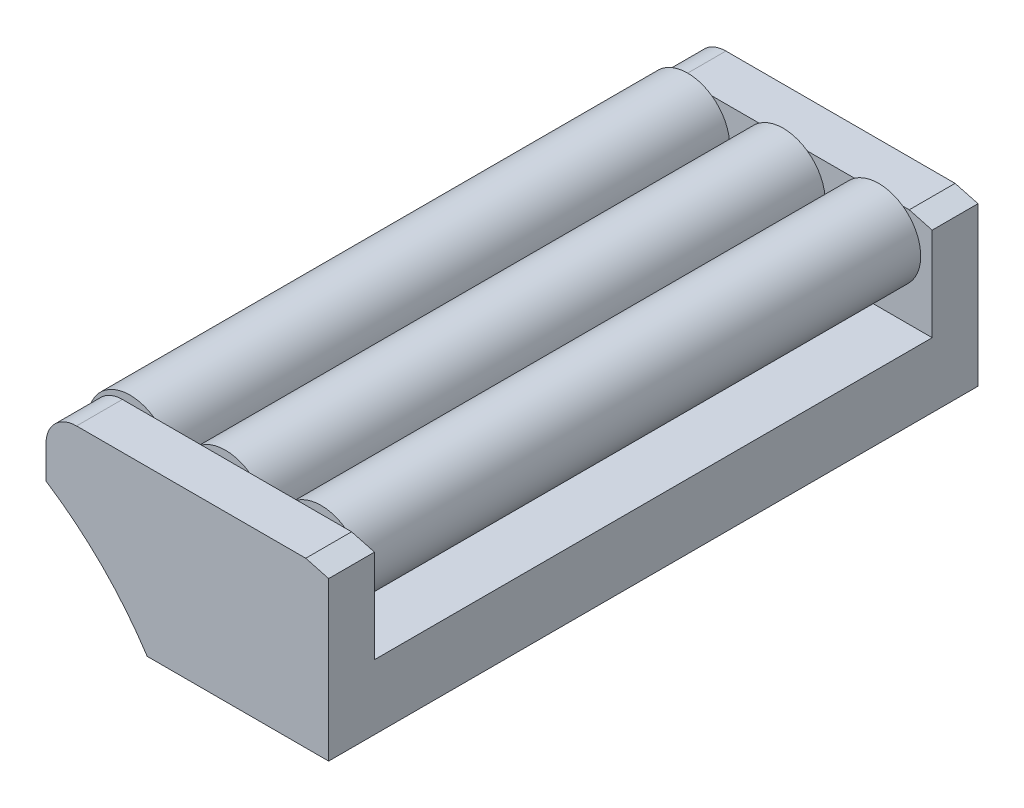
ISO-10303-21;
HEADER;
FILE_DESCRIPTION(('STEP AP214'),'2;1');
FILE_NAME('part.step','',(''),(''),'','','');
FILE_SCHEMA(('AUTOMOTIVE_DESIGN { 1 0 10303 214 1 1 1 1 }'));
ENDSEC;
DATA;
#1=APPLICATION_CONTEXT('core data for automotive mechanical design processes');
#2=APPLICATION_PROTOCOL_DEFINITION('international standard','automotive_design',2000,#1);
#3=PRODUCT_CONTEXT('',#1,'mechanical');
#4=PRODUCT('Part','Part','',(#3));
#5=PRODUCT_RELATED_PRODUCT_CATEGORY('part','',(#4));
#6=PRODUCT_DEFINITION_FORMATION('','',#4);
#7=PRODUCT_DEFINITION_CONTEXT('part definition',#1,'design');
#8=PRODUCT_DEFINITION('design','',#6,#7);
#9=PRODUCT_DEFINITION_SHAPE('','',#8);
#10=(LENGTH_UNIT() NAMED_UNIT(*) SI_UNIT(.MILLI.,.METRE.));
#11=(NAMED_UNIT(*) PLANE_ANGLE_UNIT() SI_UNIT($,.RADIAN.));
#12=(NAMED_UNIT(*) SI_UNIT($,.STERADIAN.) SOLID_ANGLE_UNIT());
#13=UNCERTAINTY_MEASURE_WITH_UNIT(LENGTH_MEASURE(1.E-05),#10,'distance_accuracy_value','');
#14=(GEOMETRIC_REPRESENTATION_CONTEXT(3) GLOBAL_UNCERTAINTY_ASSIGNED_CONTEXT((#13)) GLOBAL_UNIT_ASSIGNED_CONTEXT((#10,
#11,#12)) REPRESENTATION_CONTEXT('',''));
#15=CARTESIAN_POINT('',(0.,0.,0.));
#16=DIRECTION('',(0.,0.,1.));
#17=DIRECTION('',(1.,0.,0.));
#18=AXIS2_PLACEMENT_3D('',#15,#16,#17);
#19=CARTESIAN_POINT('',(0.,0.,85.));
#20=DIRECTION('',(1.,0.,0.));
#21=DIRECTION('',(0.,0.,-1.));
#22=AXIS2_PLACEMENT_3D('',#19,#20,#21);
#23=PLANE('',#22);
#24=DIRECTION('',(0.,-1.,0.));
#25=VECTOR('',#24,1.);
#26=CARTESIAN_POINT('',(0.,0.,0.));
#27=LINE('',#26,#25);
#28=CARTESIAN_POINT('',(0.,17.5,0.));
#29=VERTEX_POINT('',#28);
#30=CARTESIAN_POINT('',(0.,13.2458607002147,0.));
#31=VERTEX_POINT('',#30);
#32=EDGE_CURVE('E200',#29,#31,#27,.T.);
#33=ORIENTED_EDGE('',*,*,#32,.T.);
#34=DIRECTION('',(0.,0.,1.));
#35=VECTOR('',#34,1.);
#36=CARTESIAN_POINT('',(0.,13.2458607002147,0.));
#37=LINE('',#36,#35);
#38=CARTESIAN_POINT('',(0.,13.2458607002147,6.));
#39=VERTEX_POINT('',#38);
#40=EDGE_CURVE('E176',#31,#39,#37,.T.);
#41=ORIENTED_EDGE('',*,*,#40,.T.);
#42=DIRECTION('',(0.,1.,0.));
#43=VECTOR('',#42,1.);
#44=CARTESIAN_POINT('',(0.,0.,6.00000000000001));
#45=LINE('',#44,#43);
#46=CARTESIAN_POINT('',(0.,14.7087121525221,6.00000000000001));
#47=VERTEX_POINT('',#46);
#48=EDGE_CURVE('E294',#39,#47,#45,.T.);
#49=ORIENTED_EDGE('',*,*,#48,.T.);
#50=CARTESIAN_POINT('',(0.,17.5,6.00000000000001));
#51=VERTEX_POINT('',#50);
#52=EDGE_CURVE('E289',#47,#51,#45,.T.);
#53=ORIENTED_EDGE('',*,*,#52,.T.);
#54=DIRECTION('',(0.,0.,-1.));
#55=VECTOR('',#54,1.);
#56=CARTESIAN_POINT('',(0.,17.5,85.));
#57=LINE('',#56,#55);
#58=EDGE_CURVE('E267',#51,#29,#57,.T.);
#59=ORIENTED_EDGE('',*,*,#58,.T.);
#60=EDGE_LOOP('',(#33,#41,#49,#53,#59));
#61=FACE_BOUND('',#60,.T.);
#62=ADVANCED_FACE('F34',(#61),#23,.F.);
#63=CARTESIAN_POINT('',(-47.,32.1394616265751,79.));
#64=DIRECTION('',(0.,0.,1.));
#65=DIRECTION('',(1.,0.,0.));
#66=AXIS2_PLACEMENT_3D('',#63,#64,#65);
#67=PLANE('',#66);
#68=DIRECTION('',(1.,0.,0.));
#69=VECTOR('',#68,1.);
#70=CARTESIAN_POINT('',(-47.,8.50000000000004,79.));
#71=LINE('',#70,#69);
#72=CARTESIAN_POINT('',(6.09411708155683,8.50000000000001,79.));
#73=VERTEX_POINT('',#72);
#74=CARTESIAN_POINT('',(37.,8.5,79.));
#75=VERTEX_POINT('',#74);
#76=EDGE_CURVE('E374',#73,#75,#71,.T.);
#77=ORIENTED_EDGE('',*,*,#76,.F.);
#78=CARTESIAN_POINT('',(-24.5,-24.4999999999999,79.));
#79=DIRECTION('',(0.,0.,1.));
#80=DIRECTION('',(1.,0.,0.));
#81=AXIS2_PLACEMENT_3D('',#78,#79,#80);
#82=CIRCLE('',#81,45.);
#83=CARTESIAN_POINT('',(0.,13.2458607002147,79.));
#84=VERTEX_POINT('',#83);
#85=EDGE_CURVE('E50',#73,#84,#82,.T.);
#86=ORIENTED_EDGE('',*,*,#85,.T.);
#87=DIRECTION('',(0.,-1.,0.));
#88=VECTOR('',#87,1.);
#89=CARTESIAN_POINT('',(0.,0.,79.));
#90=LINE('',#89,#88);
#91=CARTESIAN_POINT('',(0.,14.7087121525221,79.));
#92=VERTEX_POINT('',#91);
#93=EDGE_CURVE('E378',#92,#84,#90,.T.);
#94=ORIENTED_EDGE('',*,*,#93,.F.);
#95=CARTESIAN_POINT('',(5.,17.,79.));
#96=DIRECTION('',(0.,0.,1.));
#97=DIRECTION('',(1.,0.,0.));
#98=AXIS2_PLACEMENT_3D('',#95,#96,#97);
#99=CIRCLE('',#98,5.5);
#100=CARTESIAN_POINT('',(8.16227766016838,21.5,79.));
#101=VERTEX_POINT('',#100);
#102=EDGE_CURVE('E360',#92,#101,#99,.T.);
#103=ORIENTED_EDGE('',*,*,#102,.T.);
#104=DIRECTION('',(-1.,0.,0.));
#105=VECTOR('',#104,1.);
#106=CARTESIAN_POINT('',(0.,21.5,79.));
#107=LINE('',#106,#105);
#108=CARTESIAN_POINT('',(14.3377223398316,21.5,79.));
#109=VERTEX_POINT('',#108);
#110=EDGE_CURVE('E400',#109,#101,#107,.T.);
#111=ORIENTED_EDGE('',*,*,#110,.F.);
#112=CARTESIAN_POINT('',(17.5,17.,79.));
#113=DIRECTION('',(0.,0.,1.));
#114=DIRECTION('',(1.,0.,0.));
#115=AXIS2_PLACEMENT_3D('',#112,#113,#114);
#116=CIRCLE('',#115,5.5);
#117=CARTESIAN_POINT('',(20.6622776601684,21.5,79.));
#118=VERTEX_POINT('',#117);
#119=EDGE_CURVE('E353',#109,#118,#116,.T.);
#120=ORIENTED_EDGE('',*,*,#119,.T.);
#121=CARTESIAN_POINT('',(26.8377223398316,21.5,79.));
#122=VERTEX_POINT('',#121);
#123=EDGE_CURVE('E242',#122,#118,#107,.T.);
#124=ORIENTED_EDGE('',*,*,#123,.F.);
#125=CARTESIAN_POINT('',(30.,17.,79.));
#126=DIRECTION('',(0.,0.,1.));
#127=DIRECTION('',(1.,0.,0.));
#128=AXIS2_PLACEMENT_3D('',#125,#126,#127);
#129=CIRCLE('',#128,5.49999999999999);
#130=CARTESIAN_POINT('',(33.1622776601684,21.5,79.));
#131=VERTEX_POINT('',#130);
#132=EDGE_CURVE('E336',#122,#131,#129,.T.);
#133=ORIENTED_EDGE('',*,*,#132,.T.);
#134=CARTESIAN_POINT('',(33.9999999999998,21.5,79.));
#135=VERTEX_POINT('',#134);
#136=EDGE_CURVE('E238',#135,#131,#107,.T.);
#137=ORIENTED_EDGE('',*,*,#136,.F.);
#138=DIRECTION('',(-0.965925826289069,0.258819045102519,0.));
#139=VECTOR('',#138,1.);
#140=CARTESIAN_POINT('',(34.,21.5,79.));
#141=LINE('',#140,#139);
#142=CARTESIAN_POINT('',(37.,20.6961524227066,79.));
#143=VERTEX_POINT('',#142);
#144=EDGE_CURVE('E263',#135,#143,#141,.F.);
#145=ORIENTED_EDGE('',*,*,#144,.T.);
#146=DIRECTION('',(0.,-1.,0.));
#147=VECTOR('',#146,1.);
#148=CARTESIAN_POINT('',(37.,32.139461626575,79.));
#149=LINE('',#148,#147);
#150=EDGE_CURVE('E364',#143,#75,#149,.T.);
#151=ORIENTED_EDGE('',*,*,#150,.T.);
#152=EDGE_LOOP('',(#77,#86,#94,#103,#111,#120,#124,#133,#137,#145,#151));
#153=FACE_BOUND('',#152,.T.);
#154=ADVANCED_FACE('F332',(#153),#67,.F.);
#155=CARTESIAN_POINT('',(-47.,32.1394616265751,6.00000000000001));
#156=DIRECTION('',(0.,0.,-1.));
#157=DIRECTION('',(0.,1.,0.));
#158=AXIS2_PLACEMENT_3D('',#155,#156,#157);
#159=PLANE('',#158);
#160=ORIENTED_EDGE('',*,*,#48,.F.);
#161=CARTESIAN_POINT('',(-24.5,-24.4999999999999,6.));
#162=DIRECTION('',(0.,0.,-1.));
#163=DIRECTION('',(0.,1.,0.));
#164=AXIS2_PLACEMENT_3D('',#161,#162,#163);
#165=CIRCLE('',#164,45.);
#166=CARTESIAN_POINT('',(6.09411708155684,8.50000000000002,6.));
#167=VERTEX_POINT('',#166);
#168=EDGE_CURVE('E182',#39,#167,#165,.T.);
#169=ORIENTED_EDGE('',*,*,#168,.T.);
#170=DIRECTION('',(1.,0.,0.));
#171=VECTOR('',#170,1.);
#172=CARTESIAN_POINT('',(-47.,8.50000000000005,6.));
#173=LINE('',#172,#171);
#174=CARTESIAN_POINT('',(37.,8.50000000000001,6.));
#175=VERTEX_POINT('',#174);
#176=EDGE_CURVE('E296',#167,#175,#173,.T.);
#177=ORIENTED_EDGE('',*,*,#176,.T.);
#178=DIRECTION('',(0.,1.,0.));
#179=VECTOR('',#178,1.);
#180=CARTESIAN_POINT('',(37.,32.139461626575,6.00000000000001));
#181=LINE('',#180,#179);
#182=CARTESIAN_POINT('',(37.,20.6961524227066,6.));
#183=VERTEX_POINT('',#182);
#184=EDGE_CURVE('E371',#175,#183,#181,.T.);
#185=ORIENTED_EDGE('',*,*,#184,.T.);
#186=DIRECTION('',(0.965925826289069,-0.258819045102519,0.));
#187=VECTOR('',#186,1.);
#188=CARTESIAN_POINT('',(34.,21.5,6.00000000000001));
#189=LINE('',#188,#187);
#190=CARTESIAN_POINT('',(33.9999999999998,21.5,6.00000000000001));
#191=VERTEX_POINT('',#190);
#192=EDGE_CURVE('E257',#183,#191,#189,.F.);
#193=ORIENTED_EDGE('',*,*,#192,.T.);
#194=DIRECTION('',(1.,0.,0.));
#195=VECTOR('',#194,1.);
#196=CARTESIAN_POINT('',(0.,21.5,6.00000000000001));
#197=LINE('',#196,#195);
#198=CARTESIAN_POINT('',(33.1622776601684,21.5,6.00000000000001));
#199=VERTEX_POINT('',#198);
#200=EDGE_CURVE('E232',#199,#191,#197,.T.);
#201=ORIENTED_EDGE('',*,*,#200,.F.);
#202=CARTESIAN_POINT('',(30.,17.,6.));
#203=DIRECTION('',(0.,0.,1.));
#204=DIRECTION('',(1.,0.,0.));
#205=AXIS2_PLACEMENT_3D('',#202,#203,#204);
#206=CIRCLE('',#205,5.49999999999999);
#207=CARTESIAN_POINT('',(26.8377223398316,21.5,6.));
#208=VERTEX_POINT('',#207);
#209=EDGE_CURVE('E193',#208,#199,#206,.T.);
#210=ORIENTED_EDGE('',*,*,#209,.F.);
#211=CARTESIAN_POINT('',(20.6622776601684,21.5,6.00000000000001));
#212=VERTEX_POINT('',#211);
#213=EDGE_CURVE('E616',#212,#208,#197,.T.);
#214=ORIENTED_EDGE('',*,*,#213,.F.);
#215=CARTESIAN_POINT('',(17.5,17.,6.));
#216=DIRECTION('',(0.,0.,1.));
#217=DIRECTION('',(1.,0.,0.));
#218=AXIS2_PLACEMENT_3D('',#215,#216,#217);
#219=CIRCLE('',#218,5.5);
#220=CARTESIAN_POINT('',(14.3377223398316,21.5,6.));
#221=VERTEX_POINT('',#220);
#222=EDGE_CURVE('E346',#221,#212,#219,.T.);
#223=ORIENTED_EDGE('',*,*,#222,.F.);
#224=CARTESIAN_POINT('',(8.16227766016838,21.5,6.));
#225=VERTEX_POINT('',#224);
#226=EDGE_CURVE('E237',#225,#221,#197,.T.);
#227=ORIENTED_EDGE('',*,*,#226,.F.);
#228=CARTESIAN_POINT('',(5.,17.,6.00000000000001));
#229=DIRECTION('',(0.,0.,-1.));
#230=DIRECTION('',(0.,1.,0.));
#231=AXIS2_PLACEMENT_3D('',#228,#229,#230);
#232=CIRCLE('',#231,5.5);
#233=EDGE_CURVE('E240',#47,#225,#232,.F.);
#234=ORIENTED_EDGE('',*,*,#233,.F.);
#235=EDGE_LOOP('',(#160,#169,#177,#185,#193,#201,#210,#214,#223,#227,#234));
#236=FACE_BOUND('',#235,.T.);
#237=ADVANCED_FACE('F426',(#236),#159,.F.);
#238=CARTESIAN_POINT('',(0.,21.5,85.));
#239=DIRECTION('',(0.,-1.,0.));
#240=DIRECTION('',(0.,0.,-1.));
#241=AXIS2_PLACEMENT_3D('',#238,#239,#240);
#242=PLANE('',#241);
#243=CARTESIAN_POINT('',(4.,21.5,79.));
#244=VERTEX_POINT('',#243);
#245=EDGE_CURVE('E236',#101,#244,#107,.T.);
#246=ORIENTED_EDGE('',*,*,#245,.T.);
#247=DIRECTION('',(0.,0.,-1.));
#248=VECTOR('',#247,1.);
#249=CARTESIAN_POINT('',(4.,21.5,85.));
#250=LINE('',#249,#248);
#251=CARTESIAN_POINT('',(4.,21.5,85.));
#252=VERTEX_POINT('',#251);
#253=EDGE_CURVE('E273',#244,#252,#250,.F.);
#254=ORIENTED_EDGE('',*,*,#253,.T.);
#255=DIRECTION('',(-1.,0.,0.));
#256=VECTOR('',#255,1.);
#257=CARTESIAN_POINT('',(0.,21.5,85.));
#258=LINE('',#257,#256);
#259=CARTESIAN_POINT('',(33.9999999999999,21.5,85.));
#260=VERTEX_POINT('',#259);
#261=EDGE_CURVE('E225',#260,#252,#258,.T.);
#262=ORIENTED_EDGE('',*,*,#261,.F.);
#263=DIRECTION('',(0.,0.,-1.));
#264=VECTOR('',#263,1.);
#265=CARTESIAN_POINT('',(34.,21.5,85.));
#266=LINE('',#265,#264);
#267=EDGE_CURVE('E260',#260,#135,#266,.T.);
#268=ORIENTED_EDGE('',*,*,#267,.T.);
#269=ORIENTED_EDGE('',*,*,#136,.T.);
#270=EDGE_CURVE('E241',#131,#122,#107,.T.);
#271=ORIENTED_EDGE('',*,*,#270,.T.);
#272=ORIENTED_EDGE('',*,*,#123,.T.);
#273=EDGE_CURVE('E401',#118,#109,#107,.T.);
#274=ORIENTED_EDGE('',*,*,#273,.T.);
#275=ORIENTED_EDGE('',*,*,#110,.T.);
#276=EDGE_LOOP('',(#246,#254,#262,#268,#269,#271,#272,#274,#275));
#277=FACE_BOUND('',#276,.T.);
#278=ADVANCED_FACE('F326',(#277),#242,.F.);
#279=ORIENTED_EDGE('',*,*,#93,.T.);
#280=CARTESIAN_POINT('',(0.,13.2458607002147,85.));
#281=VERTEX_POINT('',#280);
#282=EDGE_CURVE('E389',#84,#281,#37,.T.);
#283=ORIENTED_EDGE('',*,*,#282,.T.);
#284=DIRECTION('',(0.,-1.,0.));
#285=VECTOR('',#284,1.);
#286=CARTESIAN_POINT('',(0.,0.,85.));
#287=LINE('',#286,#285);
#288=CARTESIAN_POINT('',(0.,17.5,85.));
#289=VERTEX_POINT('',#288);
#290=EDGE_CURVE('E215',#289,#281,#287,.T.);
#291=ORIENTED_EDGE('',*,*,#290,.F.);
#292=DIRECTION('',(0.,0.,-1.));
#293=VECTOR('',#292,1.);
#294=CARTESIAN_POINT('',(0.,17.5,85.));
#295=LINE('',#294,#293);
#296=CARTESIAN_POINT('',(0.,17.5,79.));
#297=VERTEX_POINT('',#296);
#298=EDGE_CURVE('E270',#289,#297,#295,.T.);
#299=ORIENTED_EDGE('',*,*,#298,.T.);
#300=EDGE_CURVE('E209',#297,#92,#90,.T.);
#301=ORIENTED_EDGE('',*,*,#300,.T.);
#302=EDGE_LOOP('',(#279,#283,#291,#299,#301));
#303=FACE_BOUND('',#302,.T.);
#304=ADVANCED_FACE('F36',(#303),#23,.F.);
#305=CARTESIAN_POINT('',(0.,0.,85.));
#306=DIRECTION('',(0.,1.,0.));
#307=DIRECTION('',(0.,0.,1.));
#308=AXIS2_PLACEMENT_3D('',#305,#306,#307);
#309=PLANE('',#308);
#310=CARTESIAN_POINT('',(23.,0.,9.50000000000001));
#311=DIRECTION('',(0.,-1.,0.));
#312=DIRECTION('',(0.,0.,-1.));
#313=AXIS2_PLACEMENT_3D('',#310,#311,#312);
#314=CIRCLE('',#313,3.);
#315=CARTESIAN_POINT('',(23.,0.,6.5));
#316=VERTEX_POINT('',#315);
#317=EDGE_CURVE('E624',#316,#316,#314,.T.);
#318=ORIENTED_EDGE('',*,*,#317,.F.);
#319=EDGE_LOOP('',(#318));
#320=FACE_BOUND('',#319,.T.);
#321=CARTESIAN_POINT('',(23.,0.,75.5));
#322=DIRECTION('',(0.,-1.,0.));
#323=DIRECTION('',(0.,0.,-1.));
#324=AXIS2_PLACEMENT_3D('',#321,#322,#323);
#325=CIRCLE('',#324,3.);
#326=CARTESIAN_POINT('',(23.,0.,72.5));
#327=VERTEX_POINT('',#326);
#328=EDGE_CURVE('E632',#327,#327,#325,.T.);
#329=ORIENTED_EDGE('',*,*,#328,.F.);
#330=EDGE_LOOP('',(#329));
#331=FACE_BOUND('',#330,.T.);
#332=DIRECTION('',(1.,0.,0.));
#333=VECTOR('',#332,1.);
#334=CARTESIAN_POINT('',(0.,0.,85.));
#335=LINE('',#334,#333);
#336=CARTESIAN_POINT('',(13.2458607002146,0.,85.));
#337=VERTEX_POINT('',#336);
#338=CARTESIAN_POINT('',(37.,0.,85.));
#339=VERTEX_POINT('',#338);
#340=EDGE_CURVE('E191',#337,#339,#335,.T.);
#341=ORIENTED_EDGE('',*,*,#340,.F.);
#342=DIRECTION('',(0.,0.,1.));
#343=VECTOR('',#342,1.);
#344=CARTESIAN_POINT('',(13.2458607002146,0.,0.));
#345=LINE('',#344,#343);
#346=CARTESIAN_POINT('',(13.2458607002146,0.,0.));
#347=VERTEX_POINT('',#346);
#348=EDGE_CURVE('E173',#337,#347,#345,.F.);
#349=ORIENTED_EDGE('',*,*,#348,.T.);
#350=DIRECTION('',(1.,0.,0.));
#351=VECTOR('',#350,1.);
#352=CARTESIAN_POINT('',(0.,0.,0.));
#353=LINE('',#352,#351);
#354=CARTESIAN_POINT('',(37.,0.,0.));
#355=VERTEX_POINT('',#354);
#356=EDGE_CURVE('E189',#347,#355,#353,.T.);
#357=ORIENTED_EDGE('',*,*,#356,.T.);
#358=DIRECTION('',(0.,0.,-1.));
#359=VECTOR('',#358,1.);
#360=CARTESIAN_POINT('',(37.,0.,85.));
#361=LINE('',#360,#359);
#362=EDGE_CURVE('E229',#339,#355,#361,.T.);
#363=ORIENTED_EDGE('',*,*,#362,.F.);
#364=EDGE_LOOP('',(#341,#349,#357,#363));
#365=FACE_BOUND('',#364,.T.);
#366=ADVANCED_FACE('F187',(#320,#331,#365),#309,.F.);
#367=CARTESIAN_POINT('',(37.,0.,85.));
#368=DIRECTION('',(-1.,0.,0.));
#369=DIRECTION('',(0.,0.,1.));
#370=AXIS2_PLACEMENT_3D('',#367,#368,#369);
#371=PLANE('',#370);
#372=DIRECTION('',(0.,1.,0.));
#373=VECTOR('',#372,1.);
#374=CARTESIAN_POINT('',(37.,0.,0.));
#375=LINE('',#374,#373);
#376=CARTESIAN_POINT('',(37.,20.6961524227066,0.));
#377=VERTEX_POINT('',#376);
#378=EDGE_CURVE('E198',#355,#377,#375,.T.);
#379=ORIENTED_EDGE('',*,*,#378,.T.);
#380=DIRECTION('',(0.,0.,1.));
#381=VECTOR('',#380,1.);
#382=CARTESIAN_POINT('',(37.,20.6961524227066,85.));
#383=LINE('',#382,#381);
#384=EDGE_CURVE('E254',#377,#183,#383,.T.);
#385=ORIENTED_EDGE('',*,*,#384,.T.);
#386=ORIENTED_EDGE('',*,*,#184,.F.);
#387=DIRECTION('',(0.,0.,-1.));
#388=VECTOR('',#387,1.);
#389=CARTESIAN_POINT('',(37.,8.5,79.));
#390=LINE('',#389,#388);
#391=EDGE_CURVE('E367',#75,#175,#390,.T.);
#392=ORIENTED_EDGE('',*,*,#391,.F.);
#393=ORIENTED_EDGE('',*,*,#150,.F.);
#394=DIRECTION('',(0.,0.,1.));
#395=VECTOR('',#394,1.);
#396=CARTESIAN_POINT('',(37.,20.6961524227066,85.));
#397=LINE('',#396,#395);
#398=CARTESIAN_POINT('',(37.,20.6961524227066,85.));
#399=VERTEX_POINT('',#398);
#400=EDGE_CURVE('E252',#143,#399,#397,.T.);
#401=ORIENTED_EDGE('',*,*,#400,.T.);
#402=DIRECTION('',(0.,1.,0.));
#403=VECTOR('',#402,1.);
#404=CARTESIAN_POINT('',(37.,0.,85.));
#405=LINE('',#404,#403);
#406=EDGE_CURVE('E221',#339,#399,#405,.T.);
#407=ORIENTED_EDGE('',*,*,#406,.F.);
#408=ORIENTED_EDGE('',*,*,#362,.T.);
#409=EDGE_LOOP('',(#379,#385,#386,#392,#393,#401,#407,#408));
#410=FACE_BOUND('',#409,.T.);
#411=ADVANCED_FACE('F310',(#410),#371,.F.);
#412=DIRECTION('',(-1.,0.,0.));
#413=VECTOR('',#412,1.);
#414=CARTESIAN_POINT('',(0.,21.5,0.));
#415=LINE('',#414,#413);
#416=CARTESIAN_POINT('',(34.,21.5,0.));
#417=VERTEX_POINT('',#416);
#418=CARTESIAN_POINT('',(4.,21.5,0.));
#419=VERTEX_POINT('',#418);
#420=EDGE_CURVE('E206',#417,#419,#415,.T.);
#421=ORIENTED_EDGE('',*,*,#420,.T.);
#422=DIRECTION('',(0.,0.,-1.));
#423=VECTOR('',#422,1.);
#424=CARTESIAN_POINT('',(4.,21.5,85.));
#425=LINE('',#424,#423);
#426=CARTESIAN_POINT('',(4.,21.5,6.00000000000001));
#427=VERTEX_POINT('',#426);
#428=EDGE_CURVE('E57',#419,#427,#425,.F.);
#429=ORIENTED_EDGE('',*,*,#428,.T.);
#430=EDGE_CURVE('E233',#427,#225,#197,.T.);
#431=ORIENTED_EDGE('',*,*,#430,.T.);
#432=ORIENTED_EDGE('',*,*,#226,.T.);
#433=EDGE_CURVE('E613',#221,#212,#197,.T.);
#434=ORIENTED_EDGE('',*,*,#433,.T.);
#435=ORIENTED_EDGE('',*,*,#213,.T.);
#436=EDGE_CURVE('E728',#208,#199,#197,.T.);
#437=ORIENTED_EDGE('',*,*,#436,.T.);
#438=ORIENTED_EDGE('',*,*,#200,.T.);
#439=DIRECTION('',(0.,0.,-1.));
#440=VECTOR('',#439,1.);
#441=CARTESIAN_POINT('',(34.,21.5,85.));
#442=LINE('',#441,#440);
#443=EDGE_CURVE('E246',#191,#417,#442,.T.);
#444=ORIENTED_EDGE('',*,*,#443,.T.);
#445=EDGE_LOOP('',(#421,#429,#431,#432,#434,#435,#437,#438,#444));
#446=FACE_BOUND('',#445,.T.);
#447=ADVANCED_FACE('F300',(#446),#242,.F.);
#448=CARTESIAN_POINT('',(0.,21.5,85.));
#449=DIRECTION('',(0.,0.,-1.));
#450=DIRECTION('',(-1.,0.,0.));
#451=AXIS2_PLACEMENT_3D('',#448,#449,#450);
#452=PLANE('',#451);
#453=ORIENTED_EDGE('',*,*,#290,.T.);
#454=CARTESIAN_POINT('',(-24.5,-24.4999999999999,85.));
#455=DIRECTION('',(0.,0.,1.));
#456=DIRECTION('',(1.,0.,0.));
#457=AXIS2_PLACEMENT_3D('',#454,#455,#456);
#458=CIRCLE('',#457,45.);
#459=EDGE_CURVE('E183',#337,#281,#458,.T.);
#460=ORIENTED_EDGE('',*,*,#459,.F.);
#461=ORIENTED_EDGE('',*,*,#340,.T.);
#462=ORIENTED_EDGE('',*,*,#406,.T.);
#463=DIRECTION('',(0.965925826289069,-0.258819045102519,0.));
#464=VECTOR('',#463,1.);
#465=CARTESIAN_POINT('',(34.,21.5,85.));
#466=LINE('',#465,#464);
#467=EDGE_CURVE('E265',#399,#260,#466,.F.);
#468=ORIENTED_EDGE('',*,*,#467,.T.);
#469=ORIENTED_EDGE('',*,*,#261,.T.);
#470=CARTESIAN_POINT('',(4.,17.5,85.));
#471=DIRECTION('',(0.,0.,-1.));
#472=DIRECTION('',(-1.,0.,0.));
#473=AXIS2_PLACEMENT_3D('',#470,#471,#472);
#474=CIRCLE('',#473,4.);
#475=EDGE_CURVE('E276',#252,#289,#474,.F.);
#476=ORIENTED_EDGE('',*,*,#475,.T.);
#477=EDGE_LOOP('',(#453,#460,#461,#462,#468,#469,#476));
#478=FACE_BOUND('',#477,.T.);
#479=ADVANCED_FACE('F318',(#478),#452,.F.);
#480=CARTESIAN_POINT('',(0.,21.5,0.));
#481=DIRECTION('',(0.,0.,-1.));
#482=DIRECTION('',(-1.,0.,0.));
#483=AXIS2_PLACEMENT_3D('',#480,#481,#482);
#484=PLANE('',#483);
#485=CARTESIAN_POINT('',(-24.5,-24.4999999999999,0.));
#486=DIRECTION('',(0.,0.,1.));
#487=DIRECTION('',(1.,0.,0.));
#488=AXIS2_PLACEMENT_3D('',#485,#486,#487);
#489=CIRCLE('',#488,45.);
#490=EDGE_CURVE('E170',#347,#31,#489,.T.);
#491=ORIENTED_EDGE('',*,*,#490,.T.);
#492=ORIENTED_EDGE('',*,*,#32,.F.);
#493=CARTESIAN_POINT('',(4.,17.5,0.));
#494=DIRECTION('',(0.,0.,-1.));
#495=DIRECTION('',(-1.,0.,0.));
#496=AXIS2_PLACEMENT_3D('',#493,#494,#495);
#497=CIRCLE('',#496,4.);
#498=EDGE_CURVE('E278',#29,#419,#497,.T.);
#499=ORIENTED_EDGE('',*,*,#498,.T.);
#500=ORIENTED_EDGE('',*,*,#420,.F.);
#501=DIRECTION('',(-0.965925826289069,0.258819045102519,0.));
#502=VECTOR('',#501,1.);
#503=CARTESIAN_POINT('',(2.2775681356645,29.9999999999999,0.));
#504=LINE('',#503,#502);
#505=EDGE_CURVE('E250',#417,#377,#504,.F.);
#506=ORIENTED_EDGE('',*,*,#505,.T.);
#507=ORIENTED_EDGE('',*,*,#378,.F.);
#508=ORIENTED_EDGE('',*,*,#356,.F.);
#509=EDGE_LOOP('',(#491,#492,#499,#500,#506,#507,#508));
#510=FACE_BOUND('',#509,.T.);
#511=ADVANCED_FACE('F196',(#510),#484,.T.);
#512=CARTESIAN_POINT('',(-47.,8.50000000000004,79.));
#513=DIRECTION('',(0.,-1.,0.));
#514=DIRECTION('',(1.,0.,0.));
#515=AXIS2_PLACEMENT_3D('',#512,#513,#514);
#516=PLANE('',#515);
#517=CARTESIAN_POINT('',(23.,8.50000000000002,9.50000000000001));
#518=DIRECTION('',(0.,-1.,0.));
#519=DIRECTION('',(1.,0.,0.));
#520=AXIS2_PLACEMENT_3D('',#517,#518,#519);
#521=CIRCLE('',#520,3.);
#522=CARTESIAN_POINT('',(26.,8.50000000000002,9.50000000000001));
#523=VERTEX_POINT('',#522);
#524=EDGE_CURVE('E627',#523,#523,#521,.F.);
#525=ORIENTED_EDGE('',*,*,#524,.F.);
#526=EDGE_LOOP('',(#525));
#527=FACE_BOUND('',#526,.T.);
#528=CARTESIAN_POINT('',(23.,8.50000000000001,75.5));
#529=DIRECTION('',(0.,-1.,0.));
#530=DIRECTION('',(1.,0.,0.));
#531=AXIS2_PLACEMENT_3D('',#528,#529,#530);
#532=CIRCLE('',#531,3.);
#533=CARTESIAN_POINT('',(26.,8.50000000000001,75.5));
#534=VERTEX_POINT('',#533);
#535=EDGE_CURVE('E635',#534,#534,#532,.F.);
#536=ORIENTED_EDGE('',*,*,#535,.F.);
#537=EDGE_LOOP('',(#536));
#538=FACE_BOUND('',#537,.T.);
#539=ORIENTED_EDGE('',*,*,#176,.F.);
#540=DIRECTION('',(0.,0.,1.));
#541=VECTOR('',#540,1.);
#542=CARTESIAN_POINT('',(6.09411708155684,8.50000000000002,0.));
#543=LINE('',#542,#541);
#544=EDGE_CURVE('E11',#167,#73,#543,.T.);
#545=ORIENTED_EDGE('',*,*,#544,.T.);
#546=ORIENTED_EDGE('',*,*,#76,.T.);
#547=ORIENTED_EDGE('',*,*,#391,.T.);
#548=EDGE_LOOP('',(#539,#545,#546,#547));
#549=FACE_BOUND('',#548,.T.);
#550=ADVANCED_FACE('F591',(#527,#538,#549),#516,.F.);
#551=CARTESIAN_POINT('',(-47.,32.1394616265751,79.));
#552=DIRECTION('',(0.,0.,1.));
#553=DIRECTION('',(1.,0.,0.));
#554=AXIS2_PLACEMENT_3D('',#551,#552,#553);
#555=PLANE('',#554);
#556=ORIENTED_EDGE('',*,*,#300,.F.);
#557=CARTESIAN_POINT('',(4.,17.5,79.));
#558=DIRECTION('',(0.,0.,1.));
#559=DIRECTION('',(1.,0.,0.));
#560=AXIS2_PLACEMENT_3D('',#557,#558,#559);
#561=CIRCLE('',#560,4.);
#562=EDGE_CURVE('E282',#297,#244,#561,.F.);
#563=ORIENTED_EDGE('',*,*,#562,.T.);
#564=ORIENTED_EDGE('',*,*,#245,.F.);
#565=EDGE_CURVE('E361',#101,#92,#99,.T.);
#566=ORIENTED_EDGE('',*,*,#565,.T.);
#567=EDGE_LOOP('',(#556,#563,#564,#566));
#568=FACE_BOUND('',#567,.T.);
#569=ADVANCED_FACE('F398',(#568),#555,.T.);
#570=CARTESIAN_POINT('',(5.,17.,6.));
#571=DIRECTION('',(0.,0.,1.));
#572=DIRECTION('',(1.,0.,0.));
#573=AXIS2_PLACEMENT_3D('',#570,#571,#572);
#574=PLANE('',#573);
#575=CARTESIAN_POINT('',(5.,17.,6.));
#576=DIRECTION('',(0.,0.,1.));
#577=DIRECTION('',(1.,0.,0.));
#578=AXIS2_PLACEMENT_3D('',#575,#576,#577);
#579=CIRCLE('',#578,5.5);
#580=EDGE_CURVE('E357',#225,#47,#579,.T.);
#581=ORIENTED_EDGE('',*,*,#580,.F.);
#582=ORIENTED_EDGE('',*,*,#430,.F.);
#583=CARTESIAN_POINT('',(4.,17.5,6.00000000000001));
#584=DIRECTION('',(0.,0.,1.));
#585=DIRECTION('',(1.,0.,0.));
#586=AXIS2_PLACEMENT_3D('',#583,#584,#585);
#587=CIRCLE('',#586,4.);
#588=EDGE_CURVE('E43',#427,#51,#587,.T.);
#589=ORIENTED_EDGE('',*,*,#588,.T.);
#590=ORIENTED_EDGE('',*,*,#52,.F.);
#591=EDGE_LOOP('',(#581,#582,#589,#590));
#592=FACE_BOUND('',#591,.T.);
#593=ADVANCED_FACE('F288',(#592),#574,.F.);
#594=CARTESIAN_POINT('',(5.,17.,94.556349186104));
#595=DIRECTION('',(0.,0.,-1.));
#596=DIRECTION('',(-1.,0.,0.));
#597=AXIS2_PLACEMENT_3D('',#594,#595,#596);
#598=CYLINDRICAL_SURFACE('',#597,5.5);
#599=ORIENTED_EDGE('',*,*,#580,.T.);
#600=ORIENTED_EDGE('',*,*,#233,.T.);
#601=EDGE_LOOP('',(#599,#600));
#602=FACE_BOUND('',#601,.T.);
#603=ORIENTED_EDGE('',*,*,#565,.F.);
#604=ORIENTED_EDGE('',*,*,#102,.F.);
#605=EDGE_LOOP('',(#603,#604));
#606=FACE_BOUND('',#605,.T.);
#607=ADVANCED_FACE('F396',(#602,#606),#598,.T.);
#608=CARTESIAN_POINT('',(-47.,32.1394616265751,79.));
#609=DIRECTION('',(0.,0.,1.));
#610=DIRECTION('',(1.,0.,0.));
#611=AXIS2_PLACEMENT_3D('',#608,#609,#610);
#612=PLANE('',#611);
#613=ORIENTED_EDGE('',*,*,#273,.F.);
#614=EDGE_CURVE('E354',#118,#109,#116,.T.);
#615=ORIENTED_EDGE('',*,*,#614,.T.);
#616=EDGE_LOOP('',(#613,#615));
#617=FACE_BOUND('',#616,.T.);
#618=ADVANCED_FACE('F559',(#617),#612,.T.);
#619=CARTESIAN_POINT('',(17.5,17.,6.));
#620=DIRECTION('',(0.,0.,1.));
#621=DIRECTION('',(1.,0.,0.));
#622=AXIS2_PLACEMENT_3D('',#619,#620,#621);
#623=PLANE('',#622);
#624=EDGE_CURVE('E350',#212,#221,#219,.T.);
#625=ORIENTED_EDGE('',*,*,#624,.F.);
#626=ORIENTED_EDGE('',*,*,#433,.F.);
#627=EDGE_LOOP('',(#625,#626));
#628=FACE_BOUND('',#627,.T.);
#629=ADVANCED_FACE('F549',(#628),#623,.F.);
#630=CARTESIAN_POINT('',(17.5,17.,94.556349186104));
#631=DIRECTION('',(0.,0.,-1.));
#632=DIRECTION('',(-1.,0.,0.));
#633=AXIS2_PLACEMENT_3D('',#630,#631,#632);
#634=CYLINDRICAL_SURFACE('',#633,5.5);
#635=ORIENTED_EDGE('',*,*,#624,.T.);
#636=ORIENTED_EDGE('',*,*,#222,.T.);
#637=EDGE_LOOP('',(#635,#636));
#638=FACE_BOUND('',#637,.T.);
#639=ORIENTED_EDGE('',*,*,#614,.F.);
#640=ORIENTED_EDGE('',*,*,#119,.F.);
#641=EDGE_LOOP('',(#639,#640));
#642=FACE_BOUND('',#641,.T.);
#643=ADVANCED_FACE('F540',(#638,#642),#634,.T.);
#644=CARTESIAN_POINT('',(-47.,32.1394616265751,79.));
#645=DIRECTION('',(0.,0.,1.));
#646=DIRECTION('',(1.,0.,0.));
#647=AXIS2_PLACEMENT_3D('',#644,#645,#646);
#648=PLANE('',#647);
#649=ORIENTED_EDGE('',*,*,#270,.F.);
#650=EDGE_CURVE('E341',#131,#122,#129,.T.);
#651=ORIENTED_EDGE('',*,*,#650,.T.);
#652=EDGE_LOOP('',(#649,#651));
#653=FACE_BOUND('',#652,.T.);
#654=ADVANCED_FACE('F408',(#653),#648,.T.);
#655=CARTESIAN_POINT('',(30.,17.,6.));
#656=DIRECTION('',(0.,0.,1.));
#657=DIRECTION('',(1.,0.,0.));
#658=AXIS2_PLACEMENT_3D('',#655,#656,#657);
#659=PLANE('',#658);
#660=EDGE_CURVE('E342',#199,#208,#206,.T.);
#661=ORIENTED_EDGE('',*,*,#660,.F.);
#662=ORIENTED_EDGE('',*,*,#436,.F.);
#663=EDGE_LOOP('',(#661,#662));
#664=FACE_BOUND('',#663,.T.);
#665=ADVANCED_FACE('F411',(#664),#659,.F.);
#666=CARTESIAN_POINT('',(30.,17.,94.556349186104));
#667=DIRECTION('',(0.,0.,-1.));
#668=DIRECTION('',(-1.,0.,0.));
#669=AXIS2_PLACEMENT_3D('',#666,#667,#668);
#670=CYLINDRICAL_SURFACE('',#669,5.49999999999999);
#671=ORIENTED_EDGE('',*,*,#660,.T.);
#672=ORIENTED_EDGE('',*,*,#209,.T.);
#673=EDGE_LOOP('',(#671,#672));
#674=FACE_BOUND('',#673,.T.);
#675=ORIENTED_EDGE('',*,*,#650,.F.);
#676=ORIENTED_EDGE('',*,*,#132,.F.);
#677=EDGE_LOOP('',(#675,#676));
#678=FACE_BOUND('',#677,.T.);
#679=ADVANCED_FACE('F409',(#674,#678),#670,.T.);
#680=CARTESIAN_POINT('',(34.,21.5,85.));
#681=DIRECTION('',(-0.258819045102519,-0.965925826289069,0.));
#682=DIRECTION('',(0.965925826289069,-0.258819045102519,0.));
#683=AXIS2_PLACEMENT_3D('',#680,#681,#682);
#684=PLANE('',#683);
#685=ORIENTED_EDGE('',*,*,#192,.F.);
#686=ORIENTED_EDGE('',*,*,#384,.F.);
#687=ORIENTED_EDGE('',*,*,#505,.F.);
#688=ORIENTED_EDGE('',*,*,#443,.F.);
#689=EDGE_LOOP('',(#685,#686,#687,#688));
#690=FACE_BOUND('',#689,.T.);
#691=ADVANCED_FACE('F307',(#690),#684,.F.);
#692=CARTESIAN_POINT('',(34.,21.5,85.));
#693=DIRECTION('',(-0.258819045102519,-0.965925826289069,0.));
#694=DIRECTION('',(0.965925826289069,-0.258819045102519,0.));
#695=AXIS2_PLACEMENT_3D('',#692,#693,#694);
#696=PLANE('',#695);
#697=ORIENTED_EDGE('',*,*,#467,.F.);
#698=ORIENTED_EDGE('',*,*,#400,.F.);
#699=ORIENTED_EDGE('',*,*,#144,.F.);
#700=ORIENTED_EDGE('',*,*,#267,.F.);
#701=EDGE_LOOP('',(#697,#698,#699,#700));
#702=FACE_BOUND('',#701,.T.);
#703=ADVANCED_FACE('F322',(#702),#696,.F.);
#704=CARTESIAN_POINT('',(4.,17.5,85.));
#705=DIRECTION('',(0.,0.,-1.));
#706=DIRECTION('',(-1.,0.,0.));
#707=AXIS2_PLACEMENT_3D('',#704,#705,#706);
#708=CYLINDRICAL_SURFACE('',#707,4.);
#709=ORIENTED_EDGE('',*,*,#475,.F.);
#710=ORIENTED_EDGE('',*,*,#253,.F.);
#711=ORIENTED_EDGE('',*,*,#562,.F.);
#712=ORIENTED_EDGE('',*,*,#298,.F.);
#713=EDGE_LOOP('',(#709,#710,#711,#712));
#714=FACE_BOUND('',#713,.T.);
#715=ADVANCED_FACE('F492',(#714),#708,.T.);
#716=CARTESIAN_POINT('',(4.,17.5,85.));
#717=DIRECTION('',(0.,0.,-1.));
#718=DIRECTION('',(-1.,0.,0.));
#719=AXIS2_PLACEMENT_3D('',#716,#717,#718);
#720=CYLINDRICAL_SURFACE('',#719,4.);
#721=ORIENTED_EDGE('',*,*,#588,.F.);
#722=ORIENTED_EDGE('',*,*,#428,.F.);
#723=ORIENTED_EDGE('',*,*,#498,.F.);
#724=ORIENTED_EDGE('',*,*,#58,.F.);
#725=EDGE_LOOP('',(#721,#722,#723,#724));
#726=FACE_BOUND('',#725,.T.);
#727=ADVANCED_FACE('F298',(#726),#720,.T.);
#728=CARTESIAN_POINT('',(-24.5,-24.4999999999999,0.));
#729=DIRECTION('',(0.,0.,1.));
#730=DIRECTION('',(1.,0.,0.));
#731=AXIS2_PLACEMENT_3D('',#728,#729,#730);
#732=CYLINDRICAL_SURFACE('',#731,45.);
#733=ORIENTED_EDGE('',*,*,#459,.T.);
#734=ORIENTED_EDGE('',*,*,#282,.F.);
#735=ORIENTED_EDGE('',*,*,#85,.F.);
#736=ORIENTED_EDGE('',*,*,#544,.F.);
#737=ORIENTED_EDGE('',*,*,#168,.F.);
#738=ORIENTED_EDGE('',*,*,#40,.F.);
#739=ORIENTED_EDGE('',*,*,#490,.F.);
#740=ORIENTED_EDGE('',*,*,#348,.F.);
#741=EDGE_LOOP('',(#733,#734,#735,#736,#737,#738,#739,#740));
#742=FACE_BOUND('',#741,.T.);
#743=ADVANCED_FACE('F172',(#742),#732,.F.);
#744=CARTESIAN_POINT('',(23.,16.9852813742386,75.5));
#745=DIRECTION('',(0.,-1.,0.));
#746=DIRECTION('',(0.,0.,-1.));
#747=AXIS2_PLACEMENT_3D('',#744,#745,#746);
#748=CYLINDRICAL_SURFACE('',#747,3.);
#749=ORIENTED_EDGE('',*,*,#535,.T.);
#750=EDGE_LOOP('',(#749));
#751=FACE_BOUND('',#750,.T.);
#752=ORIENTED_EDGE('',*,*,#328,.T.);
#753=EDGE_LOOP('',(#752));
#754=FACE_BOUND('',#753,.T.);
#755=ADVANCED_FACE('F467',(#751,#754),#748,.F.);
#756=CARTESIAN_POINT('',(23.,16.9852813742386,9.50000000000001));
#757=DIRECTION('',(0.,-1.,0.));
#758=DIRECTION('',(0.,0.,-1.));
#759=AXIS2_PLACEMENT_3D('',#756,#757,#758);
#760=CYLINDRICAL_SURFACE('',#759,3.);
#761=ORIENTED_EDGE('',*,*,#524,.T.);
#762=EDGE_LOOP('',(#761));
#763=FACE_BOUND('',#762,.T.);
#764=ORIENTED_EDGE('',*,*,#317,.T.);
#765=EDGE_LOOP('',(#764));
#766=FACE_BOUND('',#765,.T.);
#767=ADVANCED_FACE('F463',(#763,#766),#760,.F.);
#768=CLOSED_SHELL('',(#62,#154,#237,#278,#304,#366,#411,#447,#479,#511,#550,#569,#593,#607,#618,
#629,#643,#654,#665,#679,#691,#703,#715,#727,#743,#755,#767));
#769=MANIFOLD_SOLID_BREP('B2',#768);
#770=ADVANCED_BREP_SHAPE_REPRESENTATION('',(#18,#769),#14);
#771=SHAPE_DEFINITION_REPRESENTATION(#9,#770);
ENDSEC;
END-ISO-10303-21;
